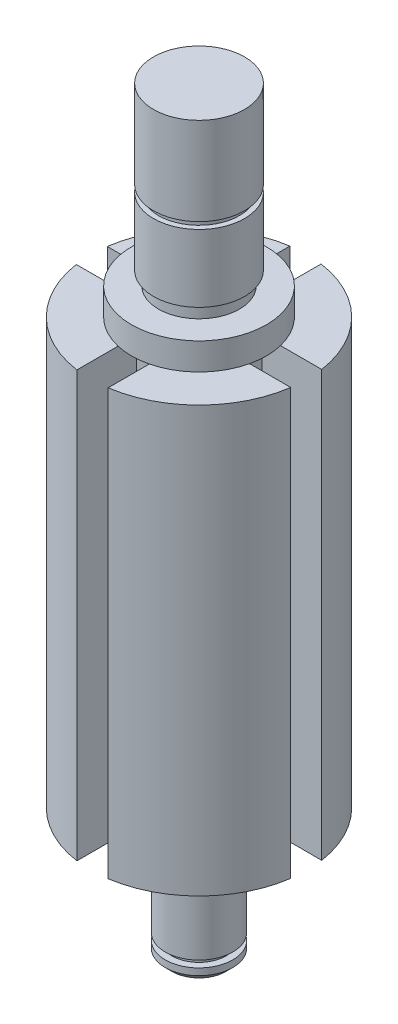
ISO-10303-21;
HEADER;
FILE_DESCRIPTION(('STEP AP214'),'2;1');
FILE_NAME('part.step','',(''),(''),'','','');
FILE_SCHEMA(('AUTOMOTIVE_DESIGN { 1 0 10303 214 1 1 1 1 }'));
ENDSEC;
DATA;
#1=APPLICATION_CONTEXT('core data for automotive mechanical design processes');
#2=APPLICATION_PROTOCOL_DEFINITION('international standard','automotive_design',2000,#1);
#3=PRODUCT_CONTEXT('',#1,'mechanical');
#4=PRODUCT('Part','Part','',(#3));
#5=PRODUCT_RELATED_PRODUCT_CATEGORY('part','',(#4));
#6=PRODUCT_DEFINITION_FORMATION('','',#4);
#7=PRODUCT_DEFINITION_CONTEXT('part definition',#1,'design');
#8=PRODUCT_DEFINITION('design','',#6,#7);
#9=PRODUCT_DEFINITION_SHAPE('','',#8);
#10=(LENGTH_UNIT() NAMED_UNIT(*) SI_UNIT(.MILLI.,.METRE.));
#11=(NAMED_UNIT(*) PLANE_ANGLE_UNIT() SI_UNIT($,.RADIAN.));
#12=(NAMED_UNIT(*) SI_UNIT($,.STERADIAN.) SOLID_ANGLE_UNIT());
#13=UNCERTAINTY_MEASURE_WITH_UNIT(LENGTH_MEASURE(1.E-05),#10,'distance_accuracy_value','');
#14=(GEOMETRIC_REPRESENTATION_CONTEXT(3) GLOBAL_UNCERTAINTY_ASSIGNED_CONTEXT((#13)) GLOBAL_UNIT_ASSIGNED_CONTEXT((#10,
#11,#12)) REPRESENTATION_CONTEXT('',''));
#15=CARTESIAN_POINT('',(0.,0.,0.));
#16=DIRECTION('',(0.,0.,1.));
#17=DIRECTION('',(1.,0.,0.));
#18=AXIS2_PLACEMENT_3D('',#15,#16,#17);
#19=CARTESIAN_POINT('',(0.,31.5,0.));
#20=DIRECTION('',(0.,1.,0.));
#21=DIRECTION('',(0.,0.,1.));
#22=AXIS2_PLACEMENT_3D('',#19,#20,#21);
#23=PLANE('',#22);
#24=CARTESIAN_POINT('',(0.,31.5,0.));
#25=DIRECTION('',(0.,1.,0.));
#26=DIRECTION('',(0.,0.,1.));
#27=AXIS2_PLACEMENT_3D('',#24,#25,#26);
#28=CIRCLE('',#27,5.);
#29=CARTESIAN_POINT('',(1.18016372993166,31.5,4.858725508871));
#30=VERTEX_POINT('',#29);
#31=CARTESIAN_POINT('',(4.87194175626118,31.5,1.12435916129975));
#32=VERTEX_POINT('',#31);
#33=EDGE_CURVE('E73',#30,#32,#28,.T.);
#34=ORIENTED_EDGE('',*,*,#33,.F.);
#35=DIRECTION('',(0.,0.,-1.));
#36=VECTOR('',#35,1.);
#37=CARTESIAN_POINT('',(1.18016372993168,31.5,0.));
#38=LINE('',#37,#36);
#39=CARTESIAN_POINT('',(1.18016372993165,31.5,7.91247202652583));
#40=VERTEX_POINT('',#39);
#41=EDGE_CURVE('E387',#40,#30,#38,.T.);
#42=ORIENTED_EDGE('',*,*,#41,.F.);
#43=CARTESIAN_POINT('',(0.,31.5,0.));
#44=DIRECTION('',(0.,1.,0.));
#45=DIRECTION('',(0.,0.,1.));
#46=AXIS2_PLACEMENT_3D('',#43,#44,#45);
#47=CIRCLE('',#46,8.);
#48=CARTESIAN_POINT('',(7.92059445221136,31.5,1.12435916129975));
#49=VERTEX_POINT('',#48);
#50=EDGE_CURVE('E390',#40,#49,#47,.T.);
#51=ORIENTED_EDGE('',*,*,#50,.T.);
#52=DIRECTION('',(-1.,0.,0.));
#53=VECTOR('',#52,1.);
#54=CARTESIAN_POINT('',(0.,31.5,1.12435916129975));
#55=LINE('',#54,#53);
#56=EDGE_CURVE('E391',#49,#32,#55,.T.);
#57=ORIENTED_EDGE('',*,*,#56,.T.);
#58=EDGE_LOOP('',(#34,#42,#51,#57));
#59=FACE_BOUND('',#58,.T.);
#60=ADVANCED_FACE('F47',(#59),#23,.T.);
#61=CARTESIAN_POINT('',(4.858725508871,31.5,-1.18016372993168));
#62=VERTEX_POINT('',#61);
#63=CARTESIAN_POINT('',(1.12435916129975,31.5,-4.87194175626118));
#64=VERTEX_POINT('',#63);
#65=EDGE_CURVE('E245',#62,#64,#28,.T.);
#66=ORIENTED_EDGE('',*,*,#65,.F.);
#67=DIRECTION('',(-1.,0.,0.));
#68=VECTOR('',#67,1.);
#69=CARTESIAN_POINT('',(0.,31.5,-1.18016372993168));
#70=LINE('',#69,#68);
#71=CARTESIAN_POINT('',(7.91247202652583,31.5,-1.18016372993168));
#72=VERTEX_POINT('',#71);
#73=EDGE_CURVE('E545',#72,#62,#70,.T.);
#74=ORIENTED_EDGE('',*,*,#73,.F.);
#75=CARTESIAN_POINT('',(1.12435916129968,31.5,-7.92059445221137));
#76=VERTEX_POINT('',#75);
#77=EDGE_CURVE('E549',#72,#76,#47,.T.);
#78=ORIENTED_EDGE('',*,*,#77,.T.);
#79=DIRECTION('',(0.,0.,1.));
#80=VECTOR('',#79,1.);
#81=CARTESIAN_POINT('',(1.12435916129987,31.5,0.));
#82=LINE('',#81,#80);
#83=EDGE_CURVE('E370',#76,#64,#82,.T.);
#84=ORIENTED_EDGE('',*,*,#83,.T.);
#85=EDGE_LOOP('',(#66,#74,#78,#84));
#86=FACE_BOUND('',#85,.T.);
#87=ADVANCED_FACE('F312',(#86),#23,.T.);
#88=CARTESIAN_POINT('',(-1.18016372993167,31.5,-4.858725508871));
#89=VERTEX_POINT('',#88);
#90=CARTESIAN_POINT('',(-4.87194175626123,31.5,-1.12435916129955));
#91=VERTEX_POINT('',#90);
#92=EDGE_CURVE('E242',#89,#91,#28,.T.);
#93=ORIENTED_EDGE('',*,*,#92,.F.);
#94=DIRECTION('',(0.,0.,1.));
#95=VECTOR('',#94,1.);
#96=CARTESIAN_POINT('',(-1.18016372993156,31.5,0.));
#97=LINE('',#96,#95);
#98=CARTESIAN_POINT('',(-1.18016372993174,31.5,-7.91247202652582));
#99=VERTEX_POINT('',#98);
#100=EDGE_CURVE('E347',#99,#89,#97,.T.);
#101=ORIENTED_EDGE('',*,*,#100,.F.);
#102=CARTESIAN_POINT('',(-7.92059445221138,31.5,-1.12435916129955));
#103=VERTEX_POINT('',#102);
#104=EDGE_CURVE('E359',#99,#103,#47,.T.);
#105=ORIENTED_EDGE('',*,*,#104,.T.);
#106=DIRECTION('',(1.,0.,0.));
#107=VECTOR('',#106,1.);
#108=CARTESIAN_POINT('',(0.,31.5,-1.12435916129956));
#109=LINE('',#108,#107);
#110=EDGE_CURVE('E349',#103,#91,#109,.T.);
#111=ORIENTED_EDGE('',*,*,#110,.T.);
#112=EDGE_LOOP('',(#93,#101,#105,#111));
#113=FACE_BOUND('',#112,.T.);
#114=ADVANCED_FACE('F318',(#113),#23,.T.);
#115=CARTESIAN_POINT('',(0.,0.,0.));
#116=DIRECTION('',(0.,1.,0.));
#117=DIRECTION('',(0.,0.,1.));
#118=AXIS2_PLACEMENT_3D('',#115,#116,#117);
#119=PLANE('',#118);
#120=CARTESIAN_POINT('',(0.,0.,0.));
#121=DIRECTION('',(0.,-1.,0.));
#122=DIRECTION('',(0.,0.,-1.));
#123=AXIS2_PLACEMENT_3D('',#120,#121,#122);
#124=CIRCLE('',#123,3.5);
#125=CARTESIAN_POINT('',(0.,0.,-3.5));
#126=VERTEX_POINT('',#125);
#127=CARTESIAN_POINT('',(3.5,0.,0.));
#128=VERTEX_POINT('',#127);
#129=EDGE_CURVE('E532',#126,#128,#124,.T.);
#130=ORIENTED_EDGE('',*,*,#129,.F.);
#131=DIRECTION('',(1.,0.,0.));
#132=VECTOR('',#131,1.);
#133=CARTESIAN_POINT('',(0.,0.,-3.5));
#134=LINE('',#133,#132);
#135=CARTESIAN_POINT('',(1.12435916129979,0.,-3.49999999999999));
#136=VERTEX_POINT('',#135);
#137=EDGE_CURVE('E413',#126,#136,#134,.T.);
#138=ORIENTED_EDGE('',*,*,#137,.T.);
#139=DIRECTION('',(0.,0.,1.));
#140=VECTOR('',#139,1.);
#141=CARTESIAN_POINT('',(1.12435916129987,0.,0.));
#142=LINE('',#141,#140);
#143=CARTESIAN_POINT('',(1.12435916129968,0.,-7.92059445221137));
#144=VERTEX_POINT('',#143);
#145=EDGE_CURVE('E407',#144,#136,#142,.T.);
#146=ORIENTED_EDGE('',*,*,#145,.F.);
#147=CARTESIAN_POINT('',(0.,0.,0.));
#148=DIRECTION('',(0.,1.,0.));
#149=DIRECTION('',(0.,0.,1.));
#150=AXIS2_PLACEMENT_3D('',#147,#148,#149);
#151=CIRCLE('',#150,8.);
#152=CARTESIAN_POINT('',(7.91247202652583,0.,-1.18016372993168));
#153=VERTEX_POINT('',#152);
#154=EDGE_CURVE('E404',#153,#144,#151,.T.);
#155=ORIENTED_EDGE('',*,*,#154,.F.);
#156=DIRECTION('',(-1.,0.,0.));
#157=VECTOR('',#156,1.);
#158=CARTESIAN_POINT('',(0.,0.,-1.18016372993168));
#159=LINE('',#158,#157);
#160=CARTESIAN_POINT('',(3.5,0.,-1.18016372993168));
#161=VERTEX_POINT('',#160);
#162=EDGE_CURVE('E399',#153,#161,#159,.T.);
#163=ORIENTED_EDGE('',*,*,#162,.T.);
#164=DIRECTION('',(0.,0.,1.));
#165=VECTOR('',#164,1.);
#166=CARTESIAN_POINT('',(3.5,0.,0.));
#167=LINE('',#166,#165);
#168=EDGE_CURVE('E395',#161,#128,#167,.T.);
#169=ORIENTED_EDGE('',*,*,#168,.T.);
#170=EDGE_LOOP('',(#130,#138,#146,#155,#163,#169));
#171=FACE_BOUND('',#170,.T.);
#172=ADVANCED_FACE('F332',(#171),#119,.F.);
#173=CARTESIAN_POINT('',(0.,0.,3.5));
#174=VERTEX_POINT('',#173);
#175=EDGE_CURVE('E516',#128,#174,#124,.T.);
#176=ORIENTED_EDGE('',*,*,#175,.F.);
#177=CARTESIAN_POINT('',(3.5,0.,1.12435916129975));
#178=VERTEX_POINT('',#177);
#179=EDGE_CURVE('E400',#128,#178,#167,.T.);
#180=ORIENTED_EDGE('',*,*,#179,.T.);
#181=DIRECTION('',(-1.,0.,0.));
#182=VECTOR('',#181,1.);
#183=CARTESIAN_POINT('',(0.,0.,1.12435916129975));
#184=LINE('',#183,#182);
#185=CARTESIAN_POINT('',(7.92059445221136,0.,1.12435916129975));
#186=VERTEX_POINT('',#185);
#187=EDGE_CURVE('E447',#186,#178,#184,.T.);
#188=ORIENTED_EDGE('',*,*,#187,.F.);
#189=CARTESIAN_POINT('',(1.18016372993165,0.,7.91247202652583));
#190=VERTEX_POINT('',#189);
#191=EDGE_CURVE('E408',#190,#186,#151,.T.);
#192=ORIENTED_EDGE('',*,*,#191,.F.);
#193=DIRECTION('',(0.,0.,-1.));
#194=VECTOR('',#193,1.);
#195=CARTESIAN_POINT('',(1.18016372993168,0.,0.));
#196=LINE('',#195,#194);
#197=CARTESIAN_POINT('',(1.18016372993167,0.,3.5));
#198=VERTEX_POINT('',#197);
#199=EDGE_CURVE('E443',#190,#198,#196,.T.);
#200=ORIENTED_EDGE('',*,*,#199,.T.);
#201=DIRECTION('',(-1.,0.,0.));
#202=VECTOR('',#201,1.);
#203=CARTESIAN_POINT('',(0.,0.,3.5));
#204=LINE('',#203,#202);
#205=EDGE_CURVE('E439',#198,#174,#204,.T.);
#206=ORIENTED_EDGE('',*,*,#205,.T.);
#207=EDGE_LOOP('',(#176,#180,#188,#192,#200,#206));
#208=FACE_BOUND('',#207,.T.);
#209=ADVANCED_FACE('F342',(#208),#119,.F.);
#210=CARTESIAN_POINT('',(-3.49999999999994,0.,0.));
#211=VERTEX_POINT('',#210);
#212=EDGE_CURVE('E616',#174,#211,#124,.T.);
#213=ORIENTED_EDGE('',*,*,#212,.F.);
#214=CARTESIAN_POINT('',(-1.12435916129976,0.,3.5));
#215=VERTEX_POINT('',#214);
#216=EDGE_CURVE('E438',#174,#215,#204,.T.);
#217=ORIENTED_EDGE('',*,*,#216,.T.);
#218=DIRECTION('',(0.,0.,-1.));
#219=VECTOR('',#218,1.);
#220=CARTESIAN_POINT('',(-1.12435916129975,0.,0.));
#221=LINE('',#220,#219);
#222=CARTESIAN_POINT('',(-1.12435916129978,0.,7.92059445221135));
#223=VERTEX_POINT('',#222);
#224=EDGE_CURVE('E435',#223,#215,#221,.T.);
#225=ORIENTED_EDGE('',*,*,#224,.F.);
#226=CARTESIAN_POINT('',(-7.9124720265258,0.,1.18016372993187));
#227=VERTEX_POINT('',#226);
#228=EDGE_CURVE('E434',#227,#223,#151,.T.);
#229=ORIENTED_EDGE('',*,*,#228,.F.);
#230=DIRECTION('',(1.,0.,0.));
#231=VECTOR('',#230,1.);
#232=CARTESIAN_POINT('',(0.,0.,1.18016372993187));
#233=LINE('',#232,#231);
#234=CARTESIAN_POINT('',(-3.49999999999994,0.,1.18016372993187));
#235=VERTEX_POINT('',#234);
#236=EDGE_CURVE('E430',#227,#235,#233,.T.);
#237=ORIENTED_EDGE('',*,*,#236,.T.);
#238=DIRECTION('',(0.,0.,-1.));
#239=VECTOR('',#238,1.);
#240=CARTESIAN_POINT('',(-3.49999999999994,0.,0.));
#241=LINE('',#240,#239);
#242=EDGE_CURVE('E426',#235,#211,#241,.T.);
#243=ORIENTED_EDGE('',*,*,#242,.T.);
#244=EDGE_LOOP('',(#213,#217,#225,#229,#237,#243));
#245=FACE_BOUND('',#244,.T.);
#246=ADVANCED_FACE('F333',(#245),#119,.F.);
#247=CARTESIAN_POINT('',(3.5,31.5,0.));
#248=DIRECTION('',(1.,0.,0.));
#249=DIRECTION('',(0.,0.,-1.));
#250=AXIS2_PLACEMENT_3D('',#247,#248,#249);
#251=PLANE('',#250);
#252=ORIENTED_EDGE('',*,*,#168,.F.);
#253=DIRECTION('',(0.,-1.,0.));
#254=VECTOR('',#253,1.);
#255=CARTESIAN_POINT('',(3.5,31.5,-1.18016372993168));
#256=LINE('',#255,#254);
#257=CARTESIAN_POINT('',(3.5,31.5,-1.18016372993168));
#258=VERTEX_POINT('',#257);
#259=EDGE_CURVE('E500',#258,#161,#256,.T.);
#260=ORIENTED_EDGE('',*,*,#259,.F.);
#261=DIRECTION('',(0.,0.,1.));
#262=VECTOR('',#261,1.);
#263=CARTESIAN_POINT('',(3.5,31.5,0.));
#264=LINE('',#263,#262);
#265=CARTESIAN_POINT('',(3.5,31.5,1.12435916129975));
#266=VERTEX_POINT('',#265);
#267=EDGE_CURVE('E451',#258,#266,#264,.T.);
#268=ORIENTED_EDGE('',*,*,#267,.T.);
#269=DIRECTION('',(0.,-1.,0.));
#270=VECTOR('',#269,1.);
#271=CARTESIAN_POINT('',(3.5,31.5,1.12435916129975));
#272=LINE('',#271,#270);
#273=EDGE_CURVE('E394',#266,#178,#272,.T.);
#274=ORIENTED_EDGE('',*,*,#273,.T.);
#275=ORIENTED_EDGE('',*,*,#179,.F.);
#276=EDGE_LOOP('',(#252,#260,#268,#274,#275));
#277=FACE_BOUND('',#276,.T.);
#278=ADVANCED_FACE('F584',(#277),#251,.T.);
#279=CARTESIAN_POINT('',(0.,31.5,-1.18016372993168));
#280=DIRECTION('',(0.,0.,1.));
#281=DIRECTION('',(1.,0.,0.));
#282=AXIS2_PLACEMENT_3D('',#279,#280,#281);
#283=PLANE('',#282);
#284=ORIENTED_EDGE('',*,*,#162,.F.);
#285=DIRECTION('',(0.,-1.,0.));
#286=VECTOR('',#285,1.);
#287=CARTESIAN_POINT('',(7.91247202652583,31.5,-1.18016372993168));
#288=LINE('',#287,#286);
#289=EDGE_CURVE('E497',#72,#153,#288,.T.);
#290=ORIENTED_EDGE('',*,*,#289,.F.);
#291=ORIENTED_EDGE('',*,*,#73,.T.);
#292=EDGE_CURVE('E544',#62,#258,#70,.T.);
#293=ORIENTED_EDGE('',*,*,#292,.T.);
#294=ORIENTED_EDGE('',*,*,#259,.T.);
#295=EDGE_LOOP('',(#284,#290,#291,#293,#294));
#296=FACE_BOUND('',#295,.T.);
#297=ADVANCED_FACE('F635',(#296),#283,.T.);
#298=CARTESIAN_POINT('',(0.,31.5,0.));
#299=DIRECTION('',(0.,-1.,0.));
#300=DIRECTION('',(0.,0.,-1.));
#301=AXIS2_PLACEMENT_3D('',#298,#299,#300);
#302=CYLINDRICAL_SURFACE('',#301,8.);
#303=ORIENTED_EDGE('',*,*,#154,.T.);
#304=DIRECTION('',(0.,-1.,0.));
#305=VECTOR('',#304,1.);
#306=CARTESIAN_POINT('',(1.12435916129968,31.5,-7.92059445221137));
#307=LINE('',#306,#305);
#308=EDGE_CURVE('E493',#76,#144,#307,.T.);
#309=ORIENTED_EDGE('',*,*,#308,.F.);
#310=ORIENTED_EDGE('',*,*,#77,.F.);
#311=ORIENTED_EDGE('',*,*,#289,.T.);
#312=EDGE_LOOP('',(#303,#309,#310,#311));
#313=FACE_BOUND('',#312,.T.);
#314=ADVANCED_FACE('F641',(#313),#302,.T.);
#315=CARTESIAN_POINT('',(1.12435916129987,31.5,0.));
#316=DIRECTION('',(1.,0.,0.));
#317=DIRECTION('',(0.,0.,-1.));
#318=AXIS2_PLACEMENT_3D('',#315,#316,#317);
#319=PLANE('',#318);
#320=ORIENTED_EDGE('',*,*,#145,.T.);
#321=DIRECTION('',(0.,-1.,0.));
#322=VECTOR('',#321,1.);
#323=CARTESIAN_POINT('',(1.12435916129979,31.5,-3.49999999999999));
#324=LINE('',#323,#322);
#325=CARTESIAN_POINT('',(1.12435916129979,31.5,-3.49999999999999));
#326=VERTEX_POINT('',#325);
#327=EDGE_CURVE('E489',#326,#136,#324,.T.);
#328=ORIENTED_EDGE('',*,*,#327,.F.);
#329=EDGE_CURVE('E551',#64,#326,#82,.T.);
#330=ORIENTED_EDGE('',*,*,#329,.F.);
#331=ORIENTED_EDGE('',*,*,#83,.F.);
#332=ORIENTED_EDGE('',*,*,#308,.T.);
#333=EDGE_LOOP('',(#320,#328,#330,#331,#332));
#334=FACE_BOUND('',#333,.T.);
#335=ADVANCED_FACE('F557',(#334),#319,.F.);
#336=CARTESIAN_POINT('',(0.,31.5,-3.5));
#337=DIRECTION('',(0.,0.,-1.));
#338=DIRECTION('',(-1.,0.,0.));
#339=AXIS2_PLACEMENT_3D('',#336,#337,#338);
#340=PLANE('',#339);
#341=CARTESIAN_POINT('',(-1.18016372993164,0.,-3.50000000000001));
#342=VERTEX_POINT('',#341);
#343=EDGE_CURVE('E414',#342,#126,#134,.T.);
#344=ORIENTED_EDGE('',*,*,#343,.F.);
#345=DIRECTION('',(0.,-1.,0.));
#346=VECTOR('',#345,1.);
#347=CARTESIAN_POINT('',(-1.18016372993164,31.5,-3.50000000000001));
#348=LINE('',#347,#346);
#349=CARTESIAN_POINT('',(-1.18016372993164,31.5,-3.50000000000001));
#350=VERTEX_POINT('',#349);
#351=EDGE_CURVE('E486',#350,#342,#348,.T.);
#352=ORIENTED_EDGE('',*,*,#351,.F.);
#353=DIRECTION('',(1.,0.,0.));
#354=VECTOR('',#353,1.);
#355=CARTESIAN_POINT('',(0.,31.5,-3.5));
#356=LINE('',#355,#354);
#357=EDGE_CURVE('E367',#350,#326,#356,.T.);
#358=ORIENTED_EDGE('',*,*,#357,.T.);
#359=ORIENTED_EDGE('',*,*,#327,.T.);
#360=ORIENTED_EDGE('',*,*,#137,.F.);
#361=EDGE_LOOP('',(#344,#352,#358,#359,#360));
#362=FACE_BOUND('',#361,.T.);
#363=ADVANCED_FACE('F562',(#362),#340,.T.);
#364=CARTESIAN_POINT('',(-1.18016372993156,31.5,0.));
#365=DIRECTION('',(1.,0.,0.));
#366=DIRECTION('',(0.,0.,-1.));
#367=AXIS2_PLACEMENT_3D('',#364,#365,#366);
#368=PLANE('',#367);
#369=DIRECTION('',(0.,0.,1.));
#370=VECTOR('',#369,1.);
#371=CARTESIAN_POINT('',(-1.18016372993156,0.,0.));
#372=LINE('',#371,#370);
#373=CARTESIAN_POINT('',(-1.18016372993174,0.,-7.91247202652582));
#374=VERTEX_POINT('',#373);
#375=EDGE_CURVE('E417',#374,#342,#372,.T.);
#376=ORIENTED_EDGE('',*,*,#375,.F.);
#377=DIRECTION('',(0.,-1.,0.));
#378=VECTOR('',#377,1.);
#379=CARTESIAN_POINT('',(-1.18016372993174,31.5,-7.91247202652582));
#380=LINE('',#379,#378);
#381=EDGE_CURVE('E356',#99,#374,#380,.T.);
#382=ORIENTED_EDGE('',*,*,#381,.F.);
#383=ORIENTED_EDGE('',*,*,#100,.T.);
#384=EDGE_CURVE('E354',#89,#350,#97,.T.);
#385=ORIENTED_EDGE('',*,*,#384,.T.);
#386=ORIENTED_EDGE('',*,*,#351,.T.);
#387=EDGE_LOOP('',(#376,#382,#383,#385,#386));
#388=FACE_BOUND('',#387,.T.);
#389=ADVANCED_FACE('F353',(#388),#368,.T.);
#390=CARTESIAN_POINT('',(-7.92059445221138,0.,-1.12435916129955));
#391=VERTEX_POINT('',#390);
#392=EDGE_CURVE('E409',#374,#391,#151,.T.);
#393=ORIENTED_EDGE('',*,*,#392,.T.);
#394=DIRECTION('',(0.,-1.,0.));
#395=VECTOR('',#394,1.);
#396=CARTESIAN_POINT('',(-7.92059445221138,31.5,-1.12435916129955));
#397=LINE('',#396,#395);
#398=EDGE_CURVE('E480',#103,#391,#397,.T.);
#399=ORIENTED_EDGE('',*,*,#398,.F.);
#400=ORIENTED_EDGE('',*,*,#104,.F.);
#401=ORIENTED_EDGE('',*,*,#381,.T.);
#402=EDGE_LOOP('',(#393,#399,#400,#401));
#403=FACE_BOUND('',#402,.T.);
#404=ADVANCED_FACE('F644',(#403),#302,.T.);
#405=CARTESIAN_POINT('',(0.,31.5,-1.12435916129956));
#406=DIRECTION('',(0.,0.,-1.));
#407=DIRECTION('',(-1.,0.,0.));
#408=AXIS2_PLACEMENT_3D('',#405,#406,#407);
#409=PLANE('',#408);
#410=DIRECTION('',(1.,0.,0.));
#411=VECTOR('',#410,1.);
#412=CARTESIAN_POINT('',(0.,0.,-1.12435916129956));
#413=LINE('',#412,#411);
#414=CARTESIAN_POINT('',(-3.49999999999994,0.,-1.12435916129955));
#415=VERTEX_POINT('',#414);
#416=EDGE_CURVE('E421',#391,#415,#413,.T.);
#417=ORIENTED_EDGE('',*,*,#416,.T.);
#418=DIRECTION('',(0.,-1.,0.));
#419=VECTOR('',#418,1.);
#420=CARTESIAN_POINT('',(-3.49999999999994,31.5,-1.12435916129955));
#421=LINE('',#420,#419);
#422=CARTESIAN_POINT('',(-3.49999999999994,31.5,-1.12435916129955));
#423=VERTEX_POINT('',#422);
#424=EDGE_CURVE('E476',#423,#415,#421,.T.);
#425=ORIENTED_EDGE('',*,*,#424,.F.);
#426=EDGE_CURVE('E377',#91,#423,#109,.T.);
#427=ORIENTED_EDGE('',*,*,#426,.F.);
#428=ORIENTED_EDGE('',*,*,#110,.F.);
#429=ORIENTED_EDGE('',*,*,#398,.T.);
#430=EDGE_LOOP('',(#417,#425,#427,#428,#429));
#431=FACE_BOUND('',#430,.T.);
#432=ADVANCED_FACE('F601',(#431),#409,.F.);
#433=CARTESIAN_POINT('',(-3.49999999999994,31.5,0.));
#434=DIRECTION('',(-1.,0.,0.));
#435=DIRECTION('',(0.,0.,1.));
#436=AXIS2_PLACEMENT_3D('',#433,#434,#435);
#437=PLANE('',#436);
#438=ORIENTED_EDGE('',*,*,#242,.F.);
#439=DIRECTION('',(0.,-1.,0.));
#440=VECTOR('',#439,1.);
#441=CARTESIAN_POINT('',(-3.49999999999994,31.5,1.18016372993187));
#442=LINE('',#441,#440);
#443=CARTESIAN_POINT('',(-3.49999999999994,31.5,1.18016372993187));
#444=VERTEX_POINT('',#443);
#445=EDGE_CURVE('E473',#444,#235,#442,.T.);
#446=ORIENTED_EDGE('',*,*,#445,.F.);
#447=DIRECTION('',(0.,0.,-1.));
#448=VECTOR('',#447,1.);
#449=CARTESIAN_POINT('',(-3.49999999999994,31.5,0.));
#450=LINE('',#449,#448);
#451=EDGE_CURVE('E376',#444,#423,#450,.T.);
#452=ORIENTED_EDGE('',*,*,#451,.T.);
#453=ORIENTED_EDGE('',*,*,#424,.T.);
#454=EDGE_CURVE('E425',#211,#415,#241,.T.);
#455=ORIENTED_EDGE('',*,*,#454,.F.);
#456=EDGE_LOOP('',(#438,#446,#452,#453,#455));
#457=FACE_BOUND('',#456,.T.);
#458=ADVANCED_FACE('F606',(#457),#437,.T.);
#459=CARTESIAN_POINT('',(0.,31.5,1.18016372993187));
#460=DIRECTION('',(0.,0.,-1.));
#461=DIRECTION('',(-1.,0.,0.));
#462=AXIS2_PLACEMENT_3D('',#459,#460,#461);
#463=PLANE('',#462);
#464=ORIENTED_EDGE('',*,*,#236,.F.);
#465=DIRECTION('',(0.,-1.,0.));
#466=VECTOR('',#465,1.);
#467=CARTESIAN_POINT('',(-7.9124720265258,31.5,1.18016372993187));
#468=LINE('',#467,#466);
#469=CARTESIAN_POINT('',(-7.9124720265258,31.5,1.18016372993187));
#470=VERTEX_POINT('',#469);
#471=EDGE_CURVE('E470',#470,#227,#468,.T.);
#472=ORIENTED_EDGE('',*,*,#471,.F.);
#473=DIRECTION('',(1.,0.,0.));
#474=VECTOR('',#473,1.);
#475=CARTESIAN_POINT('',(0.,31.5,1.18016372993187));
#476=LINE('',#475,#474);
#477=CARTESIAN_POINT('',(-4.85872550887095,31.5,1.18016372993187));
#478=VERTEX_POINT('',#477);
#479=EDGE_CURVE('E382',#470,#478,#476,.T.);
#480=ORIENTED_EDGE('',*,*,#479,.T.);
#481=EDGE_CURVE('E381',#478,#444,#476,.T.);
#482=ORIENTED_EDGE('',*,*,#481,.T.);
#483=ORIENTED_EDGE('',*,*,#445,.T.);
#484=EDGE_LOOP('',(#464,#472,#480,#482,#483));
#485=FACE_BOUND('',#484,.T.);
#486=ADVANCED_FACE('F609',(#485),#463,.T.);
#487=ORIENTED_EDGE('',*,*,#228,.T.);
#488=DIRECTION('',(0.,-1.,0.));
#489=VECTOR('',#488,1.);
#490=CARTESIAN_POINT('',(-1.12435916129978,31.5,7.92059445221135));
#491=LINE('',#490,#489);
#492=CARTESIAN_POINT('',(-1.12435916129978,31.5,7.92059445221135));
#493=VERTEX_POINT('',#492);
#494=EDGE_CURVE('E467',#493,#223,#491,.T.);
#495=ORIENTED_EDGE('',*,*,#494,.F.);
#496=EDGE_CURVE('E209',#470,#493,#47,.T.);
#497=ORIENTED_EDGE('',*,*,#496,.F.);
#498=ORIENTED_EDGE('',*,*,#471,.T.);
#499=EDGE_LOOP('',(#487,#495,#497,#498));
#500=FACE_BOUND('',#499,.T.);
#501=ADVANCED_FACE('F611',(#500),#302,.T.);
#502=CARTESIAN_POINT('',(-1.12435916129975,31.5,0.));
#503=DIRECTION('',(-1.,0.,0.));
#504=DIRECTION('',(0.,0.,1.));
#505=AXIS2_PLACEMENT_3D('',#502,#503,#504);
#506=PLANE('',#505);
#507=ORIENTED_EDGE('',*,*,#224,.T.);
#508=DIRECTION('',(0.,-1.,0.));
#509=VECTOR('',#508,1.);
#510=CARTESIAN_POINT('',(-1.12435916129976,31.5,3.5));
#511=LINE('',#510,#509);
#512=CARTESIAN_POINT('',(-1.12435916129976,31.5,3.5));
#513=VERTEX_POINT('',#512);
#514=EDGE_CURVE('E222',#513,#215,#511,.T.);
#515=ORIENTED_EDGE('',*,*,#514,.F.);
#516=DIRECTION('',(0.,0.,-1.));
#517=VECTOR('',#516,1.);
#518=CARTESIAN_POINT('',(-1.12435916129975,31.5,0.));
#519=LINE('',#518,#517);
#520=CARTESIAN_POINT('',(-1.12435916129977,31.5,4.87194175626118));
#521=VERTEX_POINT('',#520);
#522=EDGE_CURVE('E215',#521,#513,#519,.T.);
#523=ORIENTED_EDGE('',*,*,#522,.F.);
#524=EDGE_CURVE('E201',#493,#521,#519,.T.);
#525=ORIENTED_EDGE('',*,*,#524,.F.);
#526=ORIENTED_EDGE('',*,*,#494,.T.);
#527=EDGE_LOOP('',(#507,#515,#523,#525,#526));
#528=FACE_BOUND('',#527,.T.);
#529=ADVANCED_FACE('F220',(#528),#506,.F.);
#530=CARTESIAN_POINT('',(0.,31.5,3.5));
#531=DIRECTION('',(0.,0.,1.));
#532=DIRECTION('',(1.,0.,0.));
#533=AXIS2_PLACEMENT_3D('',#530,#531,#532);
#534=PLANE('',#533);
#535=ORIENTED_EDGE('',*,*,#205,.F.);
#536=DIRECTION('',(0.,-1.,0.));
#537=VECTOR('',#536,1.);
#538=CARTESIAN_POINT('',(1.18016372993167,31.5,3.5));
#539=LINE('',#538,#537);
#540=CARTESIAN_POINT('',(1.18016372993167,31.5,3.5));
#541=VERTEX_POINT('',#540);
#542=EDGE_CURVE('E462',#541,#198,#539,.T.);
#543=ORIENTED_EDGE('',*,*,#542,.F.);
#544=DIRECTION('',(-1.,0.,0.));
#545=VECTOR('',#544,1.);
#546=CARTESIAN_POINT('',(0.,31.5,3.5));
#547=LINE('',#546,#545);
#548=EDGE_CURVE('E214',#541,#513,#547,.T.);
#549=ORIENTED_EDGE('',*,*,#548,.T.);
#550=ORIENTED_EDGE('',*,*,#514,.T.);
#551=ORIENTED_EDGE('',*,*,#216,.F.);
#552=EDGE_LOOP('',(#535,#543,#549,#550,#551));
#553=FACE_BOUND('',#552,.T.);
#554=ADVANCED_FACE('F620',(#553),#534,.T.);
#555=CARTESIAN_POINT('',(1.18016372993168,31.5,0.));
#556=DIRECTION('',(-1.,0.,0.));
#557=DIRECTION('',(0.,0.,1.));
#558=AXIS2_PLACEMENT_3D('',#555,#556,#557);
#559=PLANE('',#558);
#560=ORIENTED_EDGE('',*,*,#199,.F.);
#561=DIRECTION('',(0.,-1.,0.));
#562=VECTOR('',#561,1.);
#563=CARTESIAN_POINT('',(1.18016372993165,31.5,7.91247202652583));
#564=LINE('',#563,#562);
#565=EDGE_CURVE('E459',#40,#190,#564,.T.);
#566=ORIENTED_EDGE('',*,*,#565,.F.);
#567=ORIENTED_EDGE('',*,*,#41,.T.);
#568=EDGE_CURVE('E231',#30,#541,#38,.T.);
#569=ORIENTED_EDGE('',*,*,#568,.T.);
#570=ORIENTED_EDGE('',*,*,#542,.T.);
#571=EDGE_LOOP('',(#560,#566,#567,#569,#570));
#572=FACE_BOUND('',#571,.T.);
#573=ADVANCED_FACE('F623',(#572),#559,.T.);
#574=ORIENTED_EDGE('',*,*,#191,.T.);
#575=DIRECTION('',(0.,-1.,0.));
#576=VECTOR('',#575,1.);
#577=CARTESIAN_POINT('',(7.92059445221136,31.5,1.12435916129975));
#578=LINE('',#577,#576);
#579=EDGE_CURVE('E455',#49,#186,#578,.T.);
#580=ORIENTED_EDGE('',*,*,#579,.F.);
#581=ORIENTED_EDGE('',*,*,#50,.F.);
#582=ORIENTED_EDGE('',*,*,#565,.T.);
#583=EDGE_LOOP('',(#574,#580,#581,#582));
#584=FACE_BOUND('',#583,.T.);
#585=ADVANCED_FACE('F334',(#584),#302,.T.);
#586=CARTESIAN_POINT('',(0.,31.5,1.12435916129975));
#587=DIRECTION('',(0.,0.,1.));
#588=DIRECTION('',(1.,0.,0.));
#589=AXIS2_PLACEMENT_3D('',#586,#587,#588);
#590=PLANE('',#589);
#591=ORIENTED_EDGE('',*,*,#187,.T.);
#592=ORIENTED_EDGE('',*,*,#273,.F.);
#593=EDGE_CURVE('E66',#32,#266,#55,.T.);
#594=ORIENTED_EDGE('',*,*,#593,.F.);
#595=ORIENTED_EDGE('',*,*,#56,.F.);
#596=ORIENTED_EDGE('',*,*,#579,.T.);
#597=EDGE_LOOP('',(#591,#592,#594,#595,#596));
#598=FACE_BOUND('',#597,.T.);
#599=ADVANCED_FACE('F324',(#598),#590,.F.);
#600=EDGE_CURVE('E206',#478,#521,#28,.T.);
#601=ORIENTED_EDGE('',*,*,#600,.F.);
#602=ORIENTED_EDGE('',*,*,#479,.F.);
#603=ORIENTED_EDGE('',*,*,#496,.T.);
#604=ORIENTED_EDGE('',*,*,#524,.T.);
#605=EDGE_LOOP('',(#601,#602,#603,#604));
#606=FACE_BOUND('',#605,.T.);
#607=ADVANCED_FACE('F203',(#606),#23,.T.);
#608=EDGE_CURVE('E502',#211,#126,#124,.T.);
#609=ORIENTED_EDGE('',*,*,#608,.F.);
#610=ORIENTED_EDGE('',*,*,#454,.T.);
#611=ORIENTED_EDGE('',*,*,#416,.F.);
#612=ORIENTED_EDGE('',*,*,#392,.F.);
#613=ORIENTED_EDGE('',*,*,#375,.T.);
#614=ORIENTED_EDGE('',*,*,#343,.T.);
#615=EDGE_LOOP('',(#609,#610,#611,#612,#613,#614));
#616=FACE_BOUND('',#615,.T.);
#617=ADVANCED_FACE('F323',(#616),#119,.F.);
#618=CARTESIAN_POINT('',(0.,-3.,0.));
#619=DIRECTION('',(0.,1.,0.));
#620=DIRECTION('',(0.,0.,1.));
#621=AXIS2_PLACEMENT_3D('',#618,#619,#620);
#622=CYLINDRICAL_SURFACE('',#621,3.5);
#623=CARTESIAN_POINT('',(0.,-3.,0.));
#624=DIRECTION('',(0.,-1.,0.));
#625=DIRECTION('',(0.,0.,-1.));
#626=AXIS2_PLACEMENT_3D('',#623,#624,#625);
#627=CIRCLE('',#626,3.5);
#628=CARTESIAN_POINT('',(0.,-3.,-3.5));
#629=VERTEX_POINT('',#628);
#630=EDGE_CURVE('E534',#629,#629,#627,.T.);
#631=ORIENTED_EDGE('',*,*,#630,.F.);
#632=EDGE_LOOP('',(#631));
#633=FACE_BOUND('',#632,.T.);
#634=ORIENTED_EDGE('',*,*,#129,.T.);
#635=ORIENTED_EDGE('',*,*,#175,.T.);
#636=ORIENTED_EDGE('',*,*,#212,.T.);
#637=ORIENTED_EDGE('',*,*,#608,.T.);
#638=EDGE_LOOP('',(#634,#635,#636,#637));
#639=FACE_BOUND('',#638,.T.);
#640=ADVANCED_FACE('F330',(#633,#639),#622,.T.);
#641=CARTESIAN_POINT('',(0.,-3.,0.));
#642=DIRECTION('',(0.,-1.,0.));
#643=DIRECTION('',(0.,0.,-1.));
#644=AXIS2_PLACEMENT_3D('',#641,#642,#643);
#645=PLANE('',#644);
#646=CARTESIAN_POINT('',(0.,-3.,0.));
#647=DIRECTION('',(0.,-1.,0.));
#648=DIRECTION('',(0.,0.,-1.));
#649=AXIS2_PLACEMENT_3D('',#646,#647,#648);
#650=CIRCLE('',#649,2.);
#651=CARTESIAN_POINT('',(0.,-3.,-2.));
#652=VERTEX_POINT('',#651);
#653=EDGE_CURVE('E510',#652,#652,#650,.T.);
#654=ORIENTED_EDGE('',*,*,#653,.F.);
#655=EDGE_LOOP('',(#654));
#656=FACE_BOUND('',#655,.T.);
#657=ORIENTED_EDGE('',*,*,#630,.T.);
#658=EDGE_LOOP('',(#657));
#659=FACE_BOUND('',#658,.T.);
#660=ADVANCED_FACE('F699',(#656,#659),#645,.T.);
#661=CARTESIAN_POINT('',(0.,-3.5,0.));
#662=DIRECTION('',(0.,1.,0.));
#663=DIRECTION('',(0.,0.,1.));
#664=AXIS2_PLACEMENT_3D('',#661,#662,#663);
#665=CYLINDRICAL_SURFACE('',#664,2.);
#666=CARTESIAN_POINT('',(0.,-3.5,0.));
#667=DIRECTION('',(0.,-1.,0.));
#668=DIRECTION('',(0.,0.,-1.));
#669=AXIS2_PLACEMENT_3D('',#666,#667,#668);
#670=CIRCLE('',#669,2.);
#671=CARTESIAN_POINT('',(0.,-3.5,-2.));
#672=VERTEX_POINT('',#671);
#673=EDGE_CURVE('E525',#672,#672,#670,.T.);
#674=ORIENTED_EDGE('',*,*,#673,.F.);
#675=EDGE_LOOP('',(#674));
#676=FACE_BOUND('',#675,.T.);
#677=ORIENTED_EDGE('',*,*,#653,.T.);
#678=EDGE_LOOP('',(#677));
#679=FACE_BOUND('',#678,.T.);
#680=ADVANCED_FACE('F707',(#676,#679),#665,.T.);
#681=CARTESIAN_POINT('',(0.,-8.,0.));
#682=DIRECTION('',(0.,1.,0.));
#683=DIRECTION('',(0.,0.,1.));
#684=AXIS2_PLACEMENT_3D('',#681,#682,#683);
#685=CYLINDRICAL_SURFACE('',#684,2.5);
#686=CARTESIAN_POINT('',(0.,-8.,0.));
#687=DIRECTION('',(0.,-1.,0.));
#688=DIRECTION('',(0.,0.,-1.));
#689=AXIS2_PLACEMENT_3D('',#686,#687,#688);
#690=CIRCLE('',#689,2.5);
#691=CARTESIAN_POINT('',(0.,-8.,-2.5));
#692=VERTEX_POINT('',#691);
#693=EDGE_CURVE('E521',#692,#692,#690,.T.);
#694=ORIENTED_EDGE('',*,*,#693,.F.);
#695=EDGE_LOOP('',(#694));
#696=FACE_BOUND('',#695,.T.);
#697=CARTESIAN_POINT('',(0.,-3.5,0.));
#698=DIRECTION('',(0.,-1.,0.));
#699=DIRECTION('',(0.,0.,-1.));
#700=AXIS2_PLACEMENT_3D('',#697,#698,#699);
#701=CIRCLE('',#700,2.5);
#702=CARTESIAN_POINT('',(0.,-3.5,-2.5));
#703=VERTEX_POINT('',#702);
#704=EDGE_CURVE('E526',#703,#703,#701,.T.);
#705=ORIENTED_EDGE('',*,*,#704,.T.);
#706=EDGE_LOOP('',(#705));
#707=FACE_BOUND('',#706,.T.);
#708=ADVANCED_FACE('F716',(#696,#707),#685,.T.);
#709=CARTESIAN_POINT('',(0.,-8.,0.));
#710=DIRECTION('',(0.,-1.,0.));
#711=DIRECTION('',(0.,0.,-1.));
#712=AXIS2_PLACEMENT_3D('',#709,#710,#711);
#713=PLANE('',#712);
#714=CARTESIAN_POINT('',(0.,-8.,0.));
#715=DIRECTION('',(0.,-1.,0.));
#716=DIRECTION('',(0.,0.,-1.));
#717=AXIS2_PLACEMENT_3D('',#714,#715,#716);
#718=CIRCLE('',#717,2.);
#719=CARTESIAN_POINT('',(0.,-8.,-2.));
#720=VERTEX_POINT('',#719);
#721=EDGE_CURVE('E505',#720,#720,#718,.T.);
#722=ORIENTED_EDGE('',*,*,#721,.F.);
#723=EDGE_LOOP('',(#722));
#724=FACE_BOUND('',#723,.T.);
#725=ORIENTED_EDGE('',*,*,#693,.T.);
#726=EDGE_LOOP('',(#725));
#727=FACE_BOUND('',#726,.T.);
#728=ADVANCED_FACE('F725',(#724,#727),#713,.T.);
#729=CARTESIAN_POINT('',(0.,-3.5,0.));
#730=DIRECTION('',(0.,-1.,0.));
#731=DIRECTION('',(0.,0.,-1.));
#732=AXIS2_PLACEMENT_3D('',#729,#730,#731);
#733=PLANE('',#732);
#734=ORIENTED_EDGE('',*,*,#673,.T.);
#735=EDGE_LOOP('',(#734));
#736=FACE_BOUND('',#735,.T.);
#737=ORIENTED_EDGE('',*,*,#704,.F.);
#738=EDGE_LOOP('',(#737));
#739=FACE_BOUND('',#738,.T.);
#740=ADVANCED_FACE('F734',(#736,#739),#733,.F.);
#741=CARTESIAN_POINT('',(0.,-8.5,0.));
#742=DIRECTION('',(0.,1.,0.));
#743=DIRECTION('',(0.,0.,1.));
#744=AXIS2_PLACEMENT_3D('',#741,#742,#743);
#745=CYLINDRICAL_SURFACE('',#744,2.);
#746=CARTESIAN_POINT('',(0.,-8.5,0.));
#747=DIRECTION('',(0.,-1.,0.));
#748=DIRECTION('',(0.,0.,-1.));
#749=AXIS2_PLACEMENT_3D('',#746,#747,#748);
#750=CIRCLE('',#749,2.);
#751=CARTESIAN_POINT('',(0.,-8.5,-2.));
#752=VERTEX_POINT('',#751);
#753=EDGE_CURVE('E520',#752,#752,#750,.T.);
#754=ORIENTED_EDGE('',*,*,#753,.F.);
#755=EDGE_LOOP('',(#754));
#756=FACE_BOUND('',#755,.T.);
#757=ORIENTED_EDGE('',*,*,#721,.T.);
#758=EDGE_LOOP('',(#757));
#759=FACE_BOUND('',#758,.T.);
#760=ADVANCED_FACE('F743',(#756,#759),#745,.T.);
#761=CARTESIAN_POINT('',(0.,-9.5,0.));
#762=DIRECTION('',(0.,1.,0.));
#763=DIRECTION('',(0.,0.,1.));
#764=AXIS2_PLACEMENT_3D('',#761,#762,#763);
#765=CYLINDRICAL_SURFACE('',#764,2.5);
#766=CARTESIAN_POINT('',(0.,-9.,0.));
#767=DIRECTION('',(0.,-1.,0.));
#768=DIRECTION('',(0.,0.,-1.));
#769=AXIS2_PLACEMENT_3D('',#766,#767,#768);
#770=CIRCLE('',#769,2.5);
#771=CARTESIAN_POINT('',(0.,-9.,-2.5));
#772=VERTEX_POINT('',#771);
#773=EDGE_CURVE('E52',#772,#772,#770,.F.);
#774=ORIENTED_EDGE('',*,*,#773,.T.);
#775=EDGE_LOOP('',(#774));
#776=FACE_BOUND('',#775,.T.);
#777=CARTESIAN_POINT('',(0.,-8.5,0.));
#778=DIRECTION('',(0.,-1.,0.));
#779=DIRECTION('',(0.,0.,-1.));
#780=AXIS2_PLACEMENT_3D('',#777,#778,#779);
#781=CIRCLE('',#780,2.5);
#782=CARTESIAN_POINT('',(0.,-8.5,-2.5));
#783=VERTEX_POINT('',#782);
#784=EDGE_CURVE('E257',#783,#783,#781,.T.);
#785=ORIENTED_EDGE('',*,*,#784,.T.);
#786=EDGE_LOOP('',(#785));
#787=FACE_BOUND('',#786,.T.);
#788=ADVANCED_FACE('F752',(#776,#787),#765,.T.);
#789=CARTESIAN_POINT('',(0.,-9.5,0.));
#790=DIRECTION('',(0.,-1.,0.));
#791=DIRECTION('',(0.,0.,-1.));
#792=AXIS2_PLACEMENT_3D('',#789,#790,#791);
#793=PLANE('',#792);
#794=CARTESIAN_POINT('',(0.,-9.5,0.));
#795=DIRECTION('',(0.,-1.,0.));
#796=DIRECTION('',(0.,0.,-1.));
#797=AXIS2_PLACEMENT_3D('',#794,#795,#796);
#798=CIRCLE('',#797,2.00000000000001);
#799=CARTESIAN_POINT('',(0.,-9.5,-2.00000000000001));
#800=VERTEX_POINT('',#799);
#801=EDGE_CURVE('E247',#800,#800,#798,.T.);
#802=ORIENTED_EDGE('',*,*,#801,.T.);
#803=EDGE_LOOP('',(#802));
#804=FACE_BOUND('',#803,.T.);
#805=ADVANCED_FACE('F761',(#804),#793,.T.);
#806=CARTESIAN_POINT('',(0.,-8.5,0.));
#807=DIRECTION('',(0.,-1.,0.));
#808=DIRECTION('',(0.,0.,-1.));
#809=AXIS2_PLACEMENT_3D('',#806,#807,#808);
#810=PLANE('',#809);
#811=ORIENTED_EDGE('',*,*,#753,.T.);
#812=EDGE_LOOP('',(#811));
#813=FACE_BOUND('',#812,.T.);
#814=ORIENTED_EDGE('',*,*,#784,.F.);
#815=EDGE_LOOP('',(#814));
#816=FACE_BOUND('',#815,.T.);
#817=ADVANCED_FACE('F770',(#813,#816),#810,.F.);
#818=CARTESIAN_POINT('',(0.,-9.5,0.));
#819=DIRECTION('',(0.,1.,0.));
#820=DIRECTION('',(0.,0.,1.));
#821=AXIS2_PLACEMENT_3D('',#818,#819,#820);
#822=CONICAL_SURFACE('',#821,2.00000000000001,0.785398163397439);
#823=ORIENTED_EDGE('',*,*,#773,.F.);
#824=EDGE_LOOP('',(#823));
#825=FACE_BOUND('',#824,.T.);
#826=ORIENTED_EDGE('',*,*,#801,.F.);
#827=EDGE_LOOP('',(#826));
#828=FACE_BOUND('',#827,.T.);
#829=ADVANCED_FACE('F50',(#825,#828),#822,.T.);
#830=CARTESIAN_POINT('',(0.,31.5,0.));
#831=DIRECTION('',(0.,1.,0.));
#832=DIRECTION('',(0.,0.,1.));
#833=AXIS2_PLACEMENT_3D('',#830,#831,#832);
#834=PLANE('',#833);
#835=EDGE_CURVE('E258',#64,#89,#28,.T.);
#836=ORIENTED_EDGE('',*,*,#835,.F.);
#837=ORIENTED_EDGE('',*,*,#329,.T.);
#838=ORIENTED_EDGE('',*,*,#357,.F.);
#839=ORIENTED_EDGE('',*,*,#384,.F.);
#840=EDGE_LOOP('',(#836,#837,#838,#839));
#841=FACE_BOUND('',#840,.T.);
#842=ADVANCED_FACE('F364',(#841),#834,.F.);
#843=EDGE_CURVE('E234',#91,#478,#28,.T.);
#844=ORIENTED_EDGE('',*,*,#843,.F.);
#845=ORIENTED_EDGE('',*,*,#426,.T.);
#846=ORIENTED_EDGE('',*,*,#451,.F.);
#847=ORIENTED_EDGE('',*,*,#481,.F.);
#848=EDGE_LOOP('',(#844,#845,#846,#847));
#849=FACE_BOUND('',#848,.T.);
#850=ADVANCED_FACE('F598',(#849),#834,.F.);
#851=EDGE_CURVE('E229',#521,#30,#28,.T.);
#852=ORIENTED_EDGE('',*,*,#851,.F.);
#853=ORIENTED_EDGE('',*,*,#522,.T.);
#854=ORIENTED_EDGE('',*,*,#548,.F.);
#855=ORIENTED_EDGE('',*,*,#568,.F.);
#856=EDGE_LOOP('',(#852,#853,#854,#855));
#857=FACE_BOUND('',#856,.T.);
#858=ADVANCED_FACE('F230',(#857),#834,.F.);
#859=CARTESIAN_POINT('',(0.,33.5,0.));
#860=DIRECTION('',(0.,-1.,0.));
#861=DIRECTION('',(0.,0.,-1.));
#862=AXIS2_PLACEMENT_3D('',#859,#860,#861);
#863=CYLINDRICAL_SURFACE('',#862,5.);
#864=CARTESIAN_POINT('',(0.,33.5,0.));
#865=DIRECTION('',(0.,1.,0.));
#866=DIRECTION('',(0.,0.,1.));
#867=AXIS2_PLACEMENT_3D('',#864,#865,#866);
#868=CIRCLE('',#867,5.);
#869=CARTESIAN_POINT('',(0.,33.5,5.));
#870=VERTEX_POINT('',#869);
#871=EDGE_CURVE('E251',#870,#870,#868,.T.);
#872=ORIENTED_EDGE('',*,*,#871,.F.);
#873=EDGE_LOOP('',(#872));
#874=FACE_BOUND('',#873,.T.);
#875=ORIENTED_EDGE('',*,*,#33,.T.);
#876=EDGE_CURVE('E252',#32,#62,#28,.T.);
#877=ORIENTED_EDGE('',*,*,#876,.T.);
#878=ORIENTED_EDGE('',*,*,#65,.T.);
#879=ORIENTED_EDGE('',*,*,#835,.T.);
#880=ORIENTED_EDGE('',*,*,#92,.T.);
#881=ORIENTED_EDGE('',*,*,#843,.T.);
#882=ORIENTED_EDGE('',*,*,#600,.T.);
#883=ORIENTED_EDGE('',*,*,#851,.T.);
#884=EDGE_LOOP('',(#875,#877,#878,#879,#880,#881,#882,#883));
#885=FACE_BOUND('',#884,.T.);
#886=ADVANCED_FACE('F238',(#874,#885),#863,.T.);
#887=CARTESIAN_POINT('',(0.,33.5,0.));
#888=DIRECTION('',(0.,1.,0.));
#889=DIRECTION('',(0.,0.,1.));
#890=AXIS2_PLACEMENT_3D('',#887,#888,#889);
#891=PLANE('',#890);
#892=CARTESIAN_POINT('',(0.,33.5,0.));
#893=DIRECTION('',(0.,1.,0.));
#894=DIRECTION('',(0.,0.,1.));
#895=AXIS2_PLACEMENT_3D('',#892,#893,#894);
#896=CIRCLE('',#895,3.);
#897=CARTESIAN_POINT('',(0.,33.5,3.));
#898=VERTEX_POINT('',#897);
#899=EDGE_CURVE('E58',#898,#898,#896,.T.);
#900=ORIENTED_EDGE('',*,*,#899,.F.);
#901=EDGE_LOOP('',(#900));
#902=FACE_BOUND('',#901,.T.);
#903=ORIENTED_EDGE('',*,*,#871,.T.);
#904=EDGE_LOOP('',(#903));
#905=FACE_BOUND('',#904,.T.);
#906=ADVANCED_FACE('F823',(#902,#905),#891,.T.);
#907=ORIENTED_EDGE('',*,*,#292,.F.);
#908=ORIENTED_EDGE('',*,*,#876,.F.);
#909=ORIENTED_EDGE('',*,*,#593,.T.);
#910=ORIENTED_EDGE('',*,*,#267,.F.);
#911=EDGE_LOOP('',(#907,#908,#909,#910));
#912=FACE_BOUND('',#911,.T.);
#913=ADVANCED_FACE('F589',(#912),#834,.F.);
#914=CARTESIAN_POINT('',(0.,34.5,0.));
#915=DIRECTION('',(0.,-1.,0.));
#916=DIRECTION('',(0.,0.,-1.));
#917=AXIS2_PLACEMENT_3D('',#914,#915,#916);
#918=CYLINDRICAL_SURFACE('',#917,3.);
#919=CARTESIAN_POINT('',(0.,34.5,0.));
#920=DIRECTION('',(0.,1.,0.));
#921=DIRECTION('',(0.,0.,1.));
#922=AXIS2_PLACEMENT_3D('',#919,#920,#921);
#923=CIRCLE('',#922,3.);
#924=CARTESIAN_POINT('',(0.,34.5,3.));
#925=VERTEX_POINT('',#924);
#926=EDGE_CURVE('E235',#925,#925,#923,.T.);
#927=ORIENTED_EDGE('',*,*,#926,.F.);
#928=EDGE_LOOP('',(#927));
#929=FACE_BOUND('',#928,.T.);
#930=ORIENTED_EDGE('',*,*,#899,.T.);
#931=EDGE_LOOP('',(#930));
#932=FACE_BOUND('',#931,.T.);
#933=ADVANCED_FACE('F840',(#929,#932),#918,.T.);
#934=CARTESIAN_POINT('',(0.,39.5,0.));
#935=DIRECTION('',(0.,-1.,0.));
#936=DIRECTION('',(0.,0.,-1.));
#937=AXIS2_PLACEMENT_3D('',#934,#935,#936);
#938=CYLINDRICAL_SURFACE('',#937,3.375);
#939=CARTESIAN_POINT('',(0.,39.5,0.));
#940=DIRECTION('',(0.,1.,0.));
#941=DIRECTION('',(0.,0.,1.));
#942=AXIS2_PLACEMENT_3D('',#939,#940,#941);
#943=CIRCLE('',#942,3.375);
#944=CARTESIAN_POINT('',(0.,39.5,3.375));
#945=VERTEX_POINT('',#944);
#946=EDGE_CURVE('E273',#945,#945,#943,.T.);
#947=ORIENTED_EDGE('',*,*,#946,.F.);
#948=EDGE_LOOP('',(#947));
#949=FACE_BOUND('',#948,.T.);
#950=CARTESIAN_POINT('',(0.,34.5,0.));
#951=DIRECTION('',(0.,1.,0.));
#952=DIRECTION('',(0.,0.,1.));
#953=AXIS2_PLACEMENT_3D('',#950,#951,#952);
#954=CIRCLE('',#953,3.375);
#955=CARTESIAN_POINT('',(0.,34.5,3.375));
#956=VERTEX_POINT('',#955);
#957=EDGE_CURVE('E274',#956,#956,#954,.T.);
#958=ORIENTED_EDGE('',*,*,#957,.T.);
#959=EDGE_LOOP('',(#958));
#960=FACE_BOUND('',#959,.T.);
#961=ADVANCED_FACE('F847',(#949,#960),#938,.T.);
#962=CARTESIAN_POINT('',(0.,39.5,0.));
#963=DIRECTION('',(0.,1.,0.));
#964=DIRECTION('',(0.,0.,1.));
#965=AXIS2_PLACEMENT_3D('',#962,#963,#964);
#966=PLANE('',#965);
#967=CARTESIAN_POINT('',(0.,39.5,0.));
#968=DIRECTION('',(0.,1.,0.));
#969=DIRECTION('',(0.,0.,1.));
#970=AXIS2_PLACEMENT_3D('',#967,#968,#969);
#971=CIRCLE('',#970,3.);
#972=CARTESIAN_POINT('',(0.,39.5,3.));
#973=VERTEX_POINT('',#972);
#974=EDGE_CURVE('E11',#973,#973,#971,.T.);
#975=ORIENTED_EDGE('',*,*,#974,.F.);
#976=EDGE_LOOP('',(#975));
#977=FACE_BOUND('',#976,.T.);
#978=ORIENTED_EDGE('',*,*,#946,.T.);
#979=EDGE_LOOP('',(#978));
#980=FACE_BOUND('',#979,.T.);
#981=ADVANCED_FACE('F856',(#977,#980),#966,.T.);
#982=CARTESIAN_POINT('',(0.,34.5,0.));
#983=DIRECTION('',(0.,1.,0.));
#984=DIRECTION('',(0.,0.,1.));
#985=AXIS2_PLACEMENT_3D('',#982,#983,#984);
#986=PLANE('',#985);
#987=ORIENTED_EDGE('',*,*,#926,.T.);
#988=EDGE_LOOP('',(#987));
#989=FACE_BOUND('',#988,.T.);
#990=ORIENTED_EDGE('',*,*,#957,.F.);
#991=EDGE_LOOP('',(#990));
#992=FACE_BOUND('',#991,.T.);
#993=ADVANCED_FACE('F865',(#989,#992),#986,.F.);
#994=CARTESIAN_POINT('',(0.,40.,0.));
#995=DIRECTION('',(0.,-1.,0.));
#996=DIRECTION('',(0.,0.,-1.));
#997=AXIS2_PLACEMENT_3D('',#994,#995,#996);
#998=CYLINDRICAL_SURFACE('',#997,3.);
#999=CARTESIAN_POINT('',(0.,40.,0.));
#1000=DIRECTION('',(0.,1.,0.));
#1001=DIRECTION('',(0.,0.,1.));
#1002=AXIS2_PLACEMENT_3D('',#999,#1000,#1001);
#1003=CIRCLE('',#1002,3.);
#1004=CARTESIAN_POINT('',(0.,40.,3.));
#1005=VERTEX_POINT('',#1004);
#1006=EDGE_CURVE('E278',#1005,#1005,#1003,.T.);
#1007=ORIENTED_EDGE('',*,*,#1006,.F.);
#1008=EDGE_LOOP('',(#1007));
#1009=FACE_BOUND('',#1008,.T.);
#1010=ORIENTED_EDGE('',*,*,#974,.T.);
#1011=EDGE_LOOP('',(#1010));
#1012=FACE_BOUND('',#1011,.T.);
#1013=ADVANCED_FACE('F299',(#1009,#1012),#998,.T.);
#1014=CARTESIAN_POINT('',(0.,46.5,0.));
#1015=DIRECTION('',(0.,-1.,0.));
#1016=DIRECTION('',(0.,0.,-1.));
#1017=AXIS2_PLACEMENT_3D('',#1014,#1015,#1016);
#1018=CYLINDRICAL_SURFACE('',#1017,3.375);
#1019=CARTESIAN_POINT('',(0.,46.5,0.));
#1020=DIRECTION('',(0.,1.,0.));
#1021=DIRECTION('',(0.,0.,1.));
#1022=AXIS2_PLACEMENT_3D('',#1019,#1020,#1021);
#1023=CIRCLE('',#1022,3.375);
#1024=CARTESIAN_POINT('',(0.,46.5,-3.375));
#1025=VERTEX_POINT('',#1024);
#1026=EDGE_CURVE('E285',#1025,#1025,#1023,.T.);
#1027=CARTESIAN_POINT('',(0.,40.,0.));
#1028=DIRECTION('',(0.,1.,0.));
#1029=DIRECTION('',(0.,0.,1.));
#1030=AXIS2_PLACEMENT_3D('',#1027,#1028,#1029);
#1031=CIRCLE('',#1030,3.375);
#1032=CARTESIAN_POINT('',(0.,40.,-3.375));
#1033=VERTEX_POINT('',#1032);
#1034=EDGE_CURVE('E286',#1033,#1033,#1031,.T.);
#1035=CARTESIAN_POINT('',(0.,46.5,-3.375));
#1036=CARTESIAN_POINT('',(0.,46.4322916666667,-3.375));
#1037=CARTESIAN_POINT('',(0.,46.3645833333333,-3.375));
#1038=CARTESIAN_POINT('',(0.,46.2291666666667,-3.375));
#1039=CARTESIAN_POINT('',(0.,46.1614583333333,-3.375));
#1040=CARTESIAN_POINT('',(0.,46.0260416666667,-3.375));
#1041=CARTESIAN_POINT('',(0.,45.9583333333333,-3.375));
#1042=CARTESIAN_POINT('',(0.,45.8229166666667,-3.375));
#1043=CARTESIAN_POINT('',(0.,45.7552083333333,-3.375));
#1044=CARTESIAN_POINT('',(0.,45.6197916666667,-3.375));
#1045=CARTESIAN_POINT('',(0.,45.5520833333333,-3.375));
#1046=CARTESIAN_POINT('',(0.,45.4166666666667,-3.375));
#1047=CARTESIAN_POINT('',(0.,45.3489583333333,-3.375));
#1048=CARTESIAN_POINT('',(0.,45.2135416666667,-3.375));
#1049=CARTESIAN_POINT('',(0.,45.1458333333333,-3.375));
#1050=CARTESIAN_POINT('',(0.,45.0104166666667,-3.375));
#1051=CARTESIAN_POINT('',(0.,44.9427083333333,-3.375));
#1052=CARTESIAN_POINT('',(0.,44.8072916666667,-3.375));
#1053=CARTESIAN_POINT('',(0.,44.7395833333333,-3.375));
#1054=CARTESIAN_POINT('',(0.,44.6041666666667,-3.375));
#1055=CARTESIAN_POINT('',(0.,44.5364583333333,-3.375));
#1056=CARTESIAN_POINT('',(0.,44.4010416666667,-3.375));
#1057=CARTESIAN_POINT('',(0.,44.3333333333333,-3.375));
#1058=CARTESIAN_POINT('',(0.,44.1979166666667,-3.375));
#1059=CARTESIAN_POINT('',(0.,44.1302083333333,-3.375));
#1060=CARTESIAN_POINT('',(0.,43.9947916666667,-3.375));
#1061=CARTESIAN_POINT('',(0.,43.9270833333333,-3.375));
#1062=CARTESIAN_POINT('',(0.,43.7916666666667,-3.375));
#1063=CARTESIAN_POINT('',(0.,43.7239583333333,-3.375));
#1064=CARTESIAN_POINT('',(0.,43.5885416666667,-3.375));
#1065=CARTESIAN_POINT('',(0.,43.5208333333333,-3.375));
#1066=CARTESIAN_POINT('',(0.,43.3854166666667,-3.375));
#1067=CARTESIAN_POINT('',(0.,43.3177083333333,-3.375));
#1068=CARTESIAN_POINT('',(0.,43.1822916666667,-3.375));
#1069=CARTESIAN_POINT('',(0.,43.1145833333333,-3.375));
#1070=CARTESIAN_POINT('',(0.,42.9791666666667,-3.375));
#1071=CARTESIAN_POINT('',(0.,42.9114583333333,-3.375));
#1072=CARTESIAN_POINT('',(0.,42.7760416666667,-3.375));
#1073=CARTESIAN_POINT('',(0.,42.7083333333333,-3.375));
#1074=CARTESIAN_POINT('',(0.,42.5729166666667,-3.375));
#1075=CARTESIAN_POINT('',(0.,42.5052083333333,-3.375));
#1076=CARTESIAN_POINT('',(0.,42.3697916666667,-3.375));
#1077=CARTESIAN_POINT('',(0.,42.3020833333333,-3.375));
#1078=CARTESIAN_POINT('',(0.,42.1666666666667,-3.375));
#1079=CARTESIAN_POINT('',(0.,42.0989583333333,-3.375));
#1080=CARTESIAN_POINT('',(0.,41.9635416666667,-3.375));
#1081=CARTESIAN_POINT('',(0.,41.8958333333333,-3.375));
#1082=CARTESIAN_POINT('',(0.,41.7604166666667,-3.375));
#1083=CARTESIAN_POINT('',(0.,41.6927083333333,-3.375));
#1084=CARTESIAN_POINT('',(0.,41.5572916666667,-3.375));
#1085=CARTESIAN_POINT('',(0.,41.4895833333333,-3.375));
#1086=CARTESIAN_POINT('',(0.,41.3541666666667,-3.375));
#1087=CARTESIAN_POINT('',(0.,41.2864583333333,-3.375));
#1088=CARTESIAN_POINT('',(0.,41.1510416666667,-3.375));
#1089=CARTESIAN_POINT('',(0.,41.0833333333333,-3.375));
#1090=CARTESIAN_POINT('',(0.,40.9479166666667,-3.375));
#1091=CARTESIAN_POINT('',(0.,40.8802083333333,-3.375));
#1092=CARTESIAN_POINT('',(0.,40.7447916666667,-3.375));
#1093=CARTESIAN_POINT('',(0.,40.6770833333333,-3.375));
#1094=CARTESIAN_POINT('',(0.,40.5416666666667,-3.375));
#1095=CARTESIAN_POINT('',(0.,40.4739583333333,-3.375));
#1096=CARTESIAN_POINT('',(0.,40.3385416666667,-3.375));
#1097=CARTESIAN_POINT('',(0.,40.2708333333333,-3.375));
#1098=CARTESIAN_POINT('',(0.,40.1354166666667,-3.375));
#1099=CARTESIAN_POINT('',(0.,40.0677083333333,-3.375));
#1100=CARTESIAN_POINT('',(0.,40.,-3.375));
#1101=B_SPLINE_CURVE_WITH_KNOTS('',3,(#1035,#1036,#1037,#1038,#1039,#1040,#1041,#1042,#1043,
#1044,#1045,#1046,#1047,#1048,#1049,#1050,#1051,#1052,#1053,#1054,#1055,#1056,#1057,#1058,#1059,
#1060,#1061,#1062,#1063,#1064,#1065,#1066,#1067,#1068,#1069,#1070,#1071,#1072,#1073,#1074,#1075,
#1076,#1077,#1078,#1079,#1080,#1081,#1082,#1083,#1084,#1085,#1086,#1087,#1088,#1089,#1090,#1091,
#1092,#1093,#1094,#1095,#1096,#1097,#1098,#1099,#1100),.UNSPECIFIED.,.F.,.F.,(4,2,2,2,2,2,2,2,2,
2,2,2,2,2,2,2,2,2,2,2,2,2,2,2,2,2,2,2,2,2,2,2,4),(0.,0.203125000000005,0.406250000000004,
0.609375000000002,0.812500000000001,1.01562500000001,1.21875,1.421875,1.625,1.828125,
2.03125000000001,2.234375,2.4375,2.640625,2.84375000000001,3.046875,3.25,3.453125,3.65625,
3.85937500000001,4.0625,4.265625,4.46875,4.671875,4.875,5.078125,5.28125,5.484375,5.6875,
5.890625,6.09375,6.296875,6.5),.UNSPECIFIED.);
#1102=EDGE_CURVE('BSEAM296',#1025,#1033,#1101,.T.);
#1103=ORIENTED_EDGE('',*,*,#1026,.F.);
#1104=ORIENTED_EDGE('',*,*,#1034,.T.);
#1105=ORIENTED_EDGE('',*,*,#1102,.T.);
#1106=ORIENTED_EDGE('',*,*,#1102,.F.);
#1107=EDGE_LOOP('',(#1103,#1105,#1104,#1106));
#1108=FACE_BOUND('',#1107,.T.);
#1109=ADVANCED_FACE('F296',(#1108),#1018,.T.);
#1110=CARTESIAN_POINT('',(0.,46.5,0.));
#1111=DIRECTION('',(0.,1.,0.));
#1112=DIRECTION('',(0.,0.,1.));
#1113=AXIS2_PLACEMENT_3D('',#1110,#1111,#1112);
#1114=PLANE('',#1113);
#1115=ORIENTED_EDGE('',*,*,#1026,.T.);
#1116=EDGE_LOOP('',(#1115));
#1117=FACE_BOUND('',#1116,.T.);
#1118=ADVANCED_FACE('F294',(#1117),#1114,.T.);
#1119=CARTESIAN_POINT('',(0.,40.,0.));
#1120=DIRECTION('',(0.,1.,0.));
#1121=DIRECTION('',(0.,0.,1.));
#1122=AXIS2_PLACEMENT_3D('',#1119,#1120,#1121);
#1123=PLANE('',#1122);
#1124=ORIENTED_EDGE('',*,*,#1006,.T.);
#1125=EDGE_LOOP('',(#1124));
#1126=FACE_BOUND('',#1125,.T.);
#1127=ORIENTED_EDGE('',*,*,#1034,.F.);
#1128=EDGE_LOOP('',(#1127));
#1129=FACE_BOUND('',#1128,.T.);
#1130=ADVANCED_FACE('F303',(#1126,#1129),#1123,.F.);
#1131=CLOSED_SHELL('',(#60,#87,#114,#172,#209,#246,#278,#297,#314,#335,#363,#389,#404,#432,#458,
#486,#501,#529,#554,#573,#585,#599,#607,#617,#640,#660,#680,#708,#728,#740,#760,#788,#805,#817,
#829,#842,#850,#858,#886,#906,#913,#933,#961,#981,#993,#1013,#1109,#1118,#1130));
#1132=MANIFOLD_SOLID_BREP('B2',#1131);
#1133=ADVANCED_BREP_SHAPE_REPRESENTATION('',(#18,#1132),#14);
#1134=SHAPE_DEFINITION_REPRESENTATION(#9,#1133);
ENDSEC;
END-ISO-10303-21;
